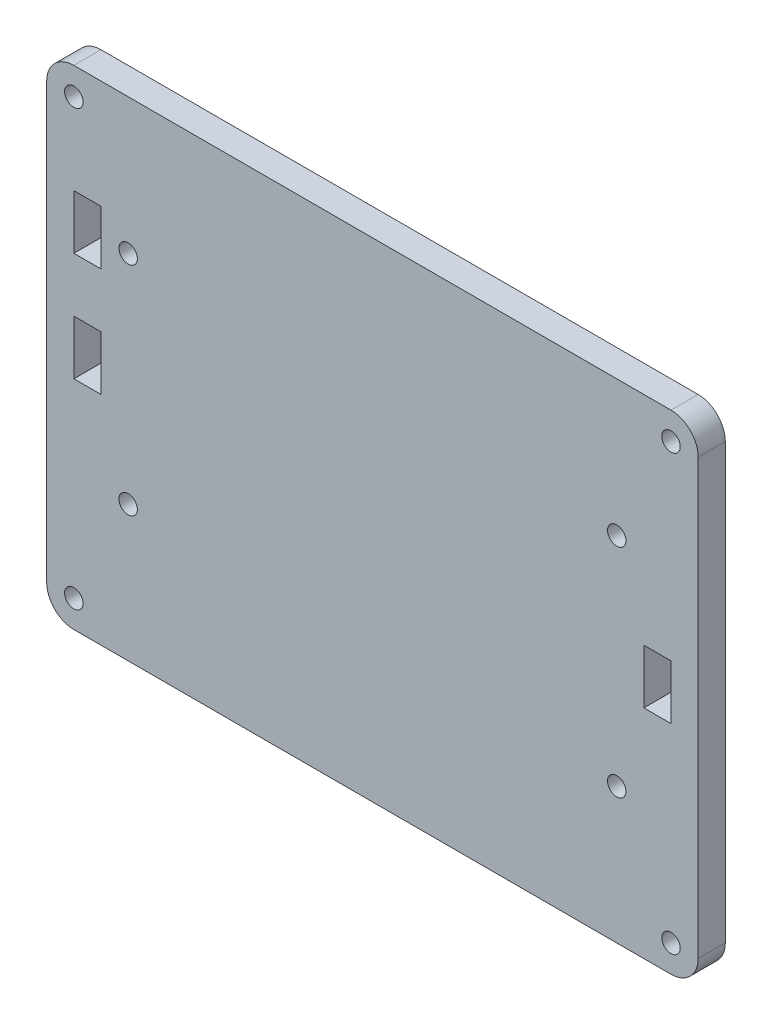
ISO-10303-21;
HEADER;
FILE_DESCRIPTION(('STEP AP214'),'2;1');
FILE_NAME('part.step','',(''),(''),'','','');
FILE_SCHEMA(('AUTOMOTIVE_DESIGN { 1 0 10303 214 1 1 1 1 }'));
ENDSEC;
DATA;
#1=APPLICATION_CONTEXT('core data for automotive mechanical design processes');
#2=APPLICATION_PROTOCOL_DEFINITION('international standard','automotive_design',2000,#1);
#3=PRODUCT_CONTEXT('',#1,'mechanical');
#4=PRODUCT('Part','Part','',(#3));
#5=PRODUCT_RELATED_PRODUCT_CATEGORY('part','',(#4));
#6=PRODUCT_DEFINITION_FORMATION('','',#4);
#7=PRODUCT_DEFINITION_CONTEXT('part definition',#1,'design');
#8=PRODUCT_DEFINITION('design','',#6,#7);
#9=PRODUCT_DEFINITION_SHAPE('','',#8);
#10=(LENGTH_UNIT() NAMED_UNIT(*) SI_UNIT(.MILLI.,.METRE.));
#11=(NAMED_UNIT(*) PLANE_ANGLE_UNIT() SI_UNIT($,.RADIAN.));
#12=(NAMED_UNIT(*) SI_UNIT($,.STERADIAN.) SOLID_ANGLE_UNIT());
#13=UNCERTAINTY_MEASURE_WITH_UNIT(LENGTH_MEASURE(1.E-05),#10,'distance_accuracy_value','');
#14=(GEOMETRIC_REPRESENTATION_CONTEXT(3) GLOBAL_UNCERTAINTY_ASSIGNED_CONTEXT((#13)) GLOBAL_UNIT_ASSIGNED_CONTEXT((#10,
#11,#12)) REPRESENTATION_CONTEXT('',''));
#15=CARTESIAN_POINT('',(0.,0.,0.));
#16=DIRECTION('',(0.,0.,1.));
#17=DIRECTION('',(1.,0.,0.));
#18=AXIS2_PLACEMENT_3D('',#15,#16,#17);
#19=CARTESIAN_POINT('',(-57.7493775578337,29.8597781429745,-5.));
#20=DIRECTION('',(0.,0.,1.));
#21=DIRECTION('',(1.,0.,0.));
#22=AXIS2_PLACEMENT_3D('',#19,#20,#21);
#23=CYLINDRICAL_SURFACE('',#22,5.);
#24=CARTESIAN_POINT('',(-57.7493775578337,29.8597781429745,0.));
#25=DIRECTION('',(0.,0.,1.));
#26=DIRECTION('',(1.,0.,0.));
#27=AXIS2_PLACEMENT_3D('',#24,#25,#26);
#28=CIRCLE('',#27,5.);
#29=CARTESIAN_POINT('',(-57.7493775578337,34.8597781429745,0.));
#30=VERTEX_POINT('',#29);
#31=CARTESIAN_POINT('',(-62.7493775578337,29.8597781429745,0.));
#32=VERTEX_POINT('',#31);
#33=EDGE_CURVE('E325',#30,#32,#28,.T.);
#34=ORIENTED_EDGE('',*,*,#33,.F.);
#35=DIRECTION('',(0.,0.,1.));
#36=VECTOR('',#35,1.);
#37=CARTESIAN_POINT('',(-57.7493775578337,34.8597781429745,-5.));
#38=LINE('',#37,#36);
#39=CARTESIAN_POINT('',(-57.7493775578337,34.8597781429745,-5.));
#40=VERTEX_POINT('',#39);
#41=EDGE_CURVE('E12',#40,#30,#38,.T.);
#42=ORIENTED_EDGE('',*,*,#41,.F.);
#43=CARTESIAN_POINT('',(-57.7493775578337,29.8597781429745,-5.));
#44=DIRECTION('',(0.,0.,1.));
#45=DIRECTION('',(1.,0.,0.));
#46=AXIS2_PLACEMENT_3D('',#43,#44,#45);
#47=CIRCLE('',#46,5.);
#48=CARTESIAN_POINT('',(-62.7493775578337,29.8597781429745,-5.));
#49=VERTEX_POINT('',#48);
#50=EDGE_CURVE('E328',#40,#49,#47,.T.);
#51=ORIENTED_EDGE('',*,*,#50,.T.);
#52=DIRECTION('',(0.,0.,1.));
#53=VECTOR('',#52,1.);
#54=CARTESIAN_POINT('',(-62.7493775578337,29.8597781429745,-5.));
#55=LINE('',#54,#53);
#56=EDGE_CURVE('E44',#49,#32,#55,.T.);
#57=ORIENTED_EDGE('',*,*,#56,.T.);
#58=EDGE_LOOP('',(#34,#42,#51,#57));
#59=FACE_BOUND('',#58,.T.);
#60=ADVANCED_FACE('F41',(#59),#23,.T.);
#61=CARTESIAN_POINT('',(-57.7493775578337,34.8597781429745,-5.));
#62=DIRECTION('',(0.,-1.,0.));
#63=DIRECTION('',(0.,0.,-1.));
#64=AXIS2_PLACEMENT_3D('',#61,#62,#63);
#65=PLANE('',#64);
#66=DIRECTION('',(1.,0.,0.));
#67=VECTOR('',#66,1.);
#68=CARTESIAN_POINT('',(-57.7493775578337,34.8597781429745,0.));
#69=LINE('',#68,#67);
#70=CARTESIAN_POINT('',(52.2506224421662,34.8597781429745,0.));
#71=VERTEX_POINT('',#70);
#72=EDGE_CURVE('E332',#30,#71,#69,.T.);
#73=ORIENTED_EDGE('',*,*,#72,.T.);
#74=DIRECTION('',(0.,0.,1.));
#75=VECTOR('',#74,1.);
#76=CARTESIAN_POINT('',(52.2506224421662,34.8597781429745,-5.));
#77=LINE('',#76,#75);
#78=CARTESIAN_POINT('',(52.2506224421662,34.8597781429745,-5.));
#79=VERTEX_POINT('',#78);
#80=EDGE_CURVE('E49',#79,#71,#77,.T.);
#81=ORIENTED_EDGE('',*,*,#80,.F.);
#82=DIRECTION('',(1.,0.,0.));
#83=VECTOR('',#82,1.);
#84=CARTESIAN_POINT('',(-57.7493775578337,34.8597781429745,-5.));
#85=LINE('',#84,#83);
#86=EDGE_CURVE('E346',#40,#79,#85,.T.);
#87=ORIENTED_EDGE('',*,*,#86,.F.);
#88=ORIENTED_EDGE('',*,*,#41,.T.);
#89=EDGE_LOOP('',(#73,#81,#87,#88));
#90=FACE_BOUND('',#89,.T.);
#91=ADVANCED_FACE('F394',(#90),#65,.F.);
#92=CARTESIAN_POINT('',(52.2506224421663,29.8597781429745,-5.));
#93=DIRECTION('',(0.,0.,1.));
#94=DIRECTION('',(1.,0.,0.));
#95=AXIS2_PLACEMENT_3D('',#92,#93,#94);
#96=CYLINDRICAL_SURFACE('',#95,5.);
#97=CARTESIAN_POINT('',(52.2506224421663,29.8597781429745,0.));
#98=DIRECTION('',(0.,0.,-1.));
#99=DIRECTION('',(-1.,0.,0.));
#100=AXIS2_PLACEMENT_3D('',#97,#98,#99);
#101=CIRCLE('',#100,5.);
#102=CARTESIAN_POINT('',(57.2506224421663,29.8597781429745,0.));
#103=VERTEX_POINT('',#102);
#104=EDGE_CURVE('E364',#71,#103,#101,.T.);
#105=ORIENTED_EDGE('',*,*,#104,.T.);
#106=DIRECTION('',(0.,0.,1.));
#107=VECTOR('',#106,1.);
#108=CARTESIAN_POINT('',(57.2506224421663,29.8597781429745,-5.));
#109=LINE('',#108,#107);
#110=CARTESIAN_POINT('',(57.2506224421663,29.8597781429745,-5.));
#111=VERTEX_POINT('',#110);
#112=EDGE_CURVE('E369',#111,#103,#109,.T.);
#113=ORIENTED_EDGE('',*,*,#112,.F.);
#114=CARTESIAN_POINT('',(52.2506224421663,29.8597781429745,-5.));
#115=DIRECTION('',(0.,0.,-1.));
#116=DIRECTION('',(-1.,0.,0.));
#117=AXIS2_PLACEMENT_3D('',#114,#115,#116);
#118=CIRCLE('',#117,5.);
#119=EDGE_CURVE('E344',#79,#111,#118,.T.);
#120=ORIENTED_EDGE('',*,*,#119,.F.);
#121=ORIENTED_EDGE('',*,*,#80,.T.);
#122=EDGE_LOOP('',(#105,#113,#120,#121));
#123=FACE_BOUND('',#122,.T.);
#124=ADVANCED_FACE('F398',(#123),#96,.T.);
#125=CARTESIAN_POINT('',(57.2506224421663,29.8597781429745,-5.));
#126=DIRECTION('',(-1.,0.,0.));
#127=DIRECTION('',(0.,-1.,0.));
#128=AXIS2_PLACEMENT_3D('',#125,#126,#127);
#129=PLANE('',#128);
#130=DIRECTION('',(0.,-1.,0.));
#131=VECTOR('',#130,1.);
#132=CARTESIAN_POINT('',(57.2506224421663,29.8597781429745,0.));
#133=LINE('',#132,#131);
#134=CARTESIAN_POINT('',(57.2506224421663,-50.1402218570254,0.));
#135=VERTEX_POINT('',#134);
#136=EDGE_CURVE('E362',#103,#135,#133,.T.);
#137=ORIENTED_EDGE('',*,*,#136,.T.);
#138=DIRECTION('',(0.,0.,1.));
#139=VECTOR('',#138,1.);
#140=CARTESIAN_POINT('',(57.2506224421663,-50.1402218570254,-5.));
#141=LINE('',#140,#139);
#142=CARTESIAN_POINT('',(57.2506224421663,-50.1402218570254,-5.));
#143=VERTEX_POINT('',#142);
#144=EDGE_CURVE('E372',#143,#135,#141,.T.);
#145=ORIENTED_EDGE('',*,*,#144,.F.);
#146=DIRECTION('',(0.,-1.,0.));
#147=VECTOR('',#146,1.);
#148=CARTESIAN_POINT('',(57.2506224421663,29.8597781429745,-5.));
#149=LINE('',#148,#147);
#150=EDGE_CURVE('E342',#111,#143,#149,.T.);
#151=ORIENTED_EDGE('',*,*,#150,.F.);
#152=ORIENTED_EDGE('',*,*,#112,.T.);
#153=EDGE_LOOP('',(#137,#145,#151,#152));
#154=FACE_BOUND('',#153,.T.);
#155=ADVANCED_FACE('F417',(#154),#129,.F.);
#156=CARTESIAN_POINT('',(52.2506224421663,-50.1402218570255,-5.));
#157=DIRECTION('',(0.,0.,1.));
#158=DIRECTION('',(1.,0.,0.));
#159=AXIS2_PLACEMENT_3D('',#156,#157,#158);
#160=CYLINDRICAL_SURFACE('',#159,5.);
#161=CARTESIAN_POINT('',(52.2506224421663,-50.1402218570255,0.));
#162=DIRECTION('',(0.,0.,-1.));
#163=DIRECTION('',(-1.,0.,0.));
#164=AXIS2_PLACEMENT_3D('',#161,#162,#163);
#165=CIRCLE('',#164,5.);
#166=CARTESIAN_POINT('',(52.2506224421663,-55.1402218570255,0.));
#167=VERTEX_POINT('',#166);
#168=EDGE_CURVE('E359',#135,#167,#165,.T.);
#169=ORIENTED_EDGE('',*,*,#168,.T.);
#170=DIRECTION('',(0.,0.,1.));
#171=VECTOR('',#170,1.);
#172=CARTESIAN_POINT('',(52.2506224421663,-55.1402218570255,-5.));
#173=LINE('',#172,#171);
#174=CARTESIAN_POINT('',(52.2506224421663,-55.1402218570255,-5.));
#175=VERTEX_POINT('',#174);
#176=EDGE_CURVE('E375',#175,#167,#173,.T.);
#177=ORIENTED_EDGE('',*,*,#176,.F.);
#178=CARTESIAN_POINT('',(52.2506224421663,-50.1402218570255,-5.));
#179=DIRECTION('',(0.,0.,-1.));
#180=DIRECTION('',(-1.,0.,0.));
#181=AXIS2_PLACEMENT_3D('',#178,#179,#180);
#182=CIRCLE('',#181,5.);
#183=EDGE_CURVE('E340',#143,#175,#182,.T.);
#184=ORIENTED_EDGE('',*,*,#183,.F.);
#185=ORIENTED_EDGE('',*,*,#144,.T.);
#186=EDGE_LOOP('',(#169,#177,#184,#185));
#187=FACE_BOUND('',#186,.T.);
#188=ADVANCED_FACE('F415',(#187),#160,.T.);
#189=CARTESIAN_POINT('',(-57.7493775578337,-55.1402218570255,-5.));
#190=DIRECTION('',(0.,-1.,0.));
#191=DIRECTION('',(0.,0.,-1.));
#192=AXIS2_PLACEMENT_3D('',#189,#190,#191);
#193=PLANE('',#192);
#194=DIRECTION('',(1.,0.,0.));
#195=VECTOR('',#194,1.);
#196=CARTESIAN_POINT('',(-57.7493775578337,-55.1402218570255,0.));
#197=LINE('',#196,#195);
#198=CARTESIAN_POINT('',(-57.7493775578337,-55.1402218570255,0.));
#199=VERTEX_POINT('',#198);
#200=EDGE_CURVE('E356',#199,#167,#197,.T.);
#201=ORIENTED_EDGE('',*,*,#200,.F.);
#202=DIRECTION('',(0.,0.,1.));
#203=VECTOR('',#202,1.);
#204=CARTESIAN_POINT('',(-57.7493775578337,-55.1402218570255,-5.));
#205=LINE('',#204,#203);
#206=CARTESIAN_POINT('',(-57.7493775578337,-55.1402218570255,-5.));
#207=VERTEX_POINT('',#206);
#208=EDGE_CURVE('E377',#207,#199,#205,.T.);
#209=ORIENTED_EDGE('',*,*,#208,.F.);
#210=DIRECTION('',(1.,0.,0.));
#211=VECTOR('',#210,1.);
#212=CARTESIAN_POINT('',(-57.7493775578337,-55.1402218570255,-5.));
#213=LINE('',#212,#211);
#214=EDGE_CURVE('E337',#207,#175,#213,.T.);
#215=ORIENTED_EDGE('',*,*,#214,.T.);
#216=ORIENTED_EDGE('',*,*,#176,.T.);
#217=EDGE_LOOP('',(#201,#209,#215,#216));
#218=FACE_BOUND('',#217,.T.);
#219=ADVANCED_FACE('F411',(#218),#193,.T.);
#220=CARTESIAN_POINT('',(-57.7493775578337,-50.1402218570255,-5.));
#221=DIRECTION('',(0.,0.,1.));
#222=DIRECTION('',(1.,0.,0.));
#223=AXIS2_PLACEMENT_3D('',#220,#221,#222);
#224=CYLINDRICAL_SURFACE('',#223,5.);
#225=CARTESIAN_POINT('',(-57.7493775578337,-50.1402218570255,0.));
#226=DIRECTION('',(0.,0.,-1.));
#227=DIRECTION('',(-1.,0.,0.));
#228=AXIS2_PLACEMENT_3D('',#225,#226,#227);
#229=CIRCLE('',#228,5.);
#230=CARTESIAN_POINT('',(-62.7493775578337,-50.1402218570254,0.));
#231=VERTEX_POINT('',#230);
#232=EDGE_CURVE('E353',#199,#231,#229,.T.);
#233=ORIENTED_EDGE('',*,*,#232,.T.);
#234=DIRECTION('',(0.,0.,1.));
#235=VECTOR('',#234,1.);
#236=CARTESIAN_POINT('',(-62.7493775578337,-50.1402218570254,-5.));
#237=LINE('',#236,#235);
#238=CARTESIAN_POINT('',(-62.7493775578337,-50.1402218570254,-5.));
#239=VERTEX_POINT('',#238);
#240=EDGE_CURVE('E378',#239,#231,#237,.T.);
#241=ORIENTED_EDGE('',*,*,#240,.F.);
#242=CARTESIAN_POINT('',(-57.7493775578337,-50.1402218570255,-5.));
#243=DIRECTION('',(0.,0.,-1.));
#244=DIRECTION('',(-1.,0.,0.));
#245=AXIS2_PLACEMENT_3D('',#242,#243,#244);
#246=CIRCLE('',#245,5.);
#247=EDGE_CURVE('E335',#207,#239,#246,.T.);
#248=ORIENTED_EDGE('',*,*,#247,.F.);
#249=ORIENTED_EDGE('',*,*,#208,.T.);
#250=EDGE_LOOP('',(#233,#241,#248,#249));
#251=FACE_BOUND('',#250,.T.);
#252=ADVANCED_FACE('F407',(#251),#224,.T.);
#253=CARTESIAN_POINT('',(-62.7493775578337,29.8597781429745,-5.));
#254=DIRECTION('',(-1.,0.,0.));
#255=DIRECTION('',(0.,-1.,0.));
#256=AXIS2_PLACEMENT_3D('',#253,#254,#255);
#257=PLANE('',#256);
#258=DIRECTION('',(0.,-1.,0.));
#259=VECTOR('',#258,1.);
#260=CARTESIAN_POINT('',(-62.7493775578337,29.8597781429745,0.));
#261=LINE('',#260,#259);
#262=EDGE_CURVE('E350',#32,#231,#261,.T.);
#263=ORIENTED_EDGE('',*,*,#262,.F.);
#264=ORIENTED_EDGE('',*,*,#56,.F.);
#265=DIRECTION('',(0.,-1.,0.));
#266=VECTOR('',#265,1.);
#267=CARTESIAN_POINT('',(-62.7493775578337,29.8597781429745,-5.));
#268=LINE('',#267,#266);
#269=EDGE_CURVE('E331',#49,#239,#268,.T.);
#270=ORIENTED_EDGE('',*,*,#269,.T.);
#271=ORIENTED_EDGE('',*,*,#240,.T.);
#272=EDGE_LOOP('',(#263,#264,#270,#271));
#273=FACE_BOUND('',#272,.T.);
#274=ADVANCED_FACE('F386',(#273),#257,.T.);
#275=CARTESIAN_POINT('',(-57.7493775578337,29.8597781429745,-5.));
#276=DIRECTION('',(0.,0.,1.));
#277=DIRECTION('',(1.,0.,0.));
#278=AXIS2_PLACEMENT_3D('',#275,#276,#277);
#279=PLANE('',#278);
#280=DIRECTION('',(-1.,0.,0.));
#281=VECTOR('',#280,1.);
#282=CARTESIAN_POINT('',(-57.7493775578337,14.8816046276279,-5.));
#283=LINE('',#282,#281);
#284=CARTESIAN_POINT('',(-52.7493775578337,14.8816046276279,-5.));
#285=VERTEX_POINT('',#284);
#286=CARTESIAN_POINT('',(-57.7493775578337,14.8816046276279,-5.));
#287=VERTEX_POINT('',#286);
#288=EDGE_CURVE('E273',#285,#287,#283,.T.);
#289=ORIENTED_EDGE('',*,*,#288,.T.);
#290=DIRECTION('',(0.,-1.,0.));
#291=VECTOR('',#290,1.);
#292=CARTESIAN_POINT('',(-57.7493775578337,29.8597781429745,-5.));
#293=LINE('',#292,#291);
#294=CARTESIAN_POINT('',(-57.7493775578337,4.88160462762794,-5.));
#295=VERTEX_POINT('',#294);
#296=EDGE_CURVE('E276',#287,#295,#293,.T.);
#297=ORIENTED_EDGE('',*,*,#296,.T.);
#298=DIRECTION('',(1.,0.,0.));
#299=VECTOR('',#298,1.);
#300=CARTESIAN_POINT('',(-57.7493775578337,4.88160462762794,-5.));
#301=LINE('',#300,#299);
#302=CARTESIAN_POINT('',(-52.7493775578337,4.88160462762794,-5.));
#303=VERTEX_POINT('',#302);
#304=EDGE_CURVE('E267',#295,#303,#301,.T.);
#305=ORIENTED_EDGE('',*,*,#304,.T.);
#306=DIRECTION('',(0.,1.,0.));
#307=VECTOR('',#306,1.);
#308=CARTESIAN_POINT('',(-52.7493775578337,29.8597781429745,-5.));
#309=LINE('',#308,#307);
#310=EDGE_CURVE('E270',#303,#285,#309,.T.);
#311=ORIENTED_EDGE('',*,*,#310,.T.);
#312=EDGE_LOOP('',(#289,#297,#305,#311));
#313=FACE_BOUND('',#312,.T.);
#314=DIRECTION('',(1.,0.,0.));
#315=VECTOR('',#314,1.);
#316=CARTESIAN_POINT('',(-57.7493775578335,-15.1402218570257,-5.));
#317=LINE('',#316,#315);
#318=CARTESIAN_POINT('',(47.2506224421666,-15.1402218570251,-5.));
#319=VERTEX_POINT('',#318);
#320=CARTESIAN_POINT('',(52.2506224421666,-15.1402218570251,-5.));
#321=VERTEX_POINT('',#320);
#322=EDGE_CURVE('E264',#319,#321,#317,.T.);
#323=ORIENTED_EDGE('',*,*,#322,.T.);
#324=DIRECTION('',(0.,1.,0.));
#325=VECTOR('',#324,1.);
#326=CARTESIAN_POINT('',(52.2506224421663,29.8597781429752,-5.));
#327=LINE('',#326,#325);
#328=CARTESIAN_POINT('',(52.2506224421666,-5.1402218570251,-5.));
#329=VERTEX_POINT('',#328);
#330=EDGE_CURVE('E185',#321,#329,#327,.T.);
#331=ORIENTED_EDGE('',*,*,#330,.T.);
#332=DIRECTION('',(-1.,0.,0.));
#333=VECTOR('',#332,1.);
#334=CARTESIAN_POINT('',(-57.7493775578335,-5.14022185702571,-5.));
#335=LINE('',#334,#333);
#336=CARTESIAN_POINT('',(47.2506224421666,-5.14022185702513,-5.));
#337=VERTEX_POINT('',#336);
#338=EDGE_CURVE('E258',#329,#337,#335,.T.);
#339=ORIENTED_EDGE('',*,*,#338,.T.);
#340=DIRECTION('',(0.,-1.,0.));
#341=VECTOR('',#340,1.);
#342=CARTESIAN_POINT('',(47.2506224421663,29.8597781429753,-5.));
#343=LINE('',#342,#341);
#344=EDGE_CURVE('E261',#337,#319,#343,.T.);
#345=ORIENTED_EDGE('',*,*,#344,.T.);
#346=EDGE_LOOP('',(#323,#331,#339,#345));
#347=FACE_BOUND('',#346,.T.);
#348=DIRECTION('',(-1.,0.,0.));
#349=VECTOR('',#348,1.);
#350=CARTESIAN_POINT('',(-57.7493775578337,-5.14022185702547,-5.));
#351=LINE('',#350,#349);
#352=CARTESIAN_POINT('',(-52.7493775578337,-5.14022185702547,-5.));
#353=VERTEX_POINT('',#352);
#354=CARTESIAN_POINT('',(-57.7493775578337,-5.14022185702547,-5.));
#355=VERTEX_POINT('',#354);
#356=EDGE_CURVE('E252',#353,#355,#351,.T.);
#357=ORIENTED_EDGE('',*,*,#356,.T.);
#358=DIRECTION('',(0.,-1.,0.));
#359=VECTOR('',#358,1.);
#360=CARTESIAN_POINT('',(-57.7493775578337,29.8597781429745,-5.));
#361=LINE('',#360,#359);
#362=CARTESIAN_POINT('',(-57.7493775578337,-15.1402218570255,-5.));
#363=VERTEX_POINT('',#362);
#364=EDGE_CURVE('E255',#355,#363,#361,.T.);
#365=ORIENTED_EDGE('',*,*,#364,.T.);
#366=DIRECTION('',(1.,0.,0.));
#367=VECTOR('',#366,1.);
#368=CARTESIAN_POINT('',(-57.7493775578337,-15.1402218570255,-5.));
#369=LINE('',#368,#367);
#370=CARTESIAN_POINT('',(-52.7493775578337,-15.1402218570255,-5.));
#371=VERTEX_POINT('',#370);
#372=EDGE_CURVE('E240',#363,#371,#369,.T.);
#373=ORIENTED_EDGE('',*,*,#372,.T.);
#374=DIRECTION('',(0.,1.,0.));
#375=VECTOR('',#374,1.);
#376=CARTESIAN_POINT('',(-52.7493775578337,29.8597781429745,-5.));
#377=LINE('',#376,#375);
#378=EDGE_CURVE('E249',#371,#353,#377,.T.);
#379=ORIENTED_EDGE('',*,*,#378,.T.);
#380=EDGE_LOOP('',(#357,#365,#373,#379));
#381=FACE_BOUND('',#380,.T.);
#382=CARTESIAN_POINT('',(52.2506224421663,29.8597781429745,-5.));
#383=DIRECTION('',(0.,0.,1.));
#384=DIRECTION('',(1.,0.,0.));
#385=AXIS2_PLACEMENT_3D('',#382,#383,#384);
#386=CIRCLE('',#385,1.7);
#387=CARTESIAN_POINT('',(53.9506224421663,29.8597781429745,-5.));
#388=VERTEX_POINT('',#387);
#389=EDGE_CURVE('E298',#388,#388,#386,.T.);
#390=ORIENTED_EDGE('',*,*,#389,.T.);
#391=EDGE_LOOP('',(#390));
#392=FACE_BOUND('',#391,.T.);
#393=CARTESIAN_POINT('',(-47.7493775578337,9.85977814297453,-5.));
#394=DIRECTION('',(0.,0.,1.));
#395=DIRECTION('',(1.,0.,0.));
#396=AXIS2_PLACEMENT_3D('',#393,#394,#395);
#397=CIRCLE('',#396,1.7);
#398=CARTESIAN_POINT('',(-46.0493775578337,9.85977814297453,-5.));
#399=VERTEX_POINT('',#398);
#400=EDGE_CURVE('E305',#399,#399,#397,.T.);
#401=ORIENTED_EDGE('',*,*,#400,.T.);
#402=EDGE_LOOP('',(#401));
#403=FACE_BOUND('',#402,.T.);
#404=CARTESIAN_POINT('',(-57.7493775578337,-50.1402218570255,-5.));
#405=DIRECTION('',(0.,0.,1.));
#406=DIRECTION('',(1.,0.,0.));
#407=AXIS2_PLACEMENT_3D('',#404,#405,#406);
#408=CIRCLE('',#407,1.7);
#409=CARTESIAN_POINT('',(-56.0493775578337,-50.1402218570255,-5.));
#410=VERTEX_POINT('',#409);
#411=EDGE_CURVE('E311',#410,#410,#408,.T.);
#412=ORIENTED_EDGE('',*,*,#411,.T.);
#413=EDGE_LOOP('',(#412));
#414=FACE_BOUND('',#413,.T.);
#415=CARTESIAN_POINT('',(52.2506224421663,-50.1402218570255,-5.));
#416=DIRECTION('',(0.,0.,1.));
#417=DIRECTION('',(1.,0.,0.));
#418=AXIS2_PLACEMENT_3D('',#415,#416,#417);
#419=CIRCLE('',#418,1.7);
#420=CARTESIAN_POINT('',(53.9506224421663,-50.1402218570255,-5.));
#421=VERTEX_POINT('',#420);
#422=EDGE_CURVE('E317',#421,#421,#419,.T.);
#423=ORIENTED_EDGE('',*,*,#422,.T.);
#424=EDGE_LOOP('',(#423));
#425=FACE_BOUND('',#424,.T.);
#426=CARTESIAN_POINT('',(42.2506224421663,-30.1402218570255,-5.));
#427=DIRECTION('',(0.,0.,1.));
#428=DIRECTION('',(1.,0.,0.));
#429=AXIS2_PLACEMENT_3D('',#426,#427,#428);
#430=CIRCLE('',#429,1.7);
#431=CARTESIAN_POINT('',(43.9506224421663,-30.1402218570255,-5.));
#432=VERTEX_POINT('',#431);
#433=EDGE_CURVE('E280',#432,#432,#430,.T.);
#434=ORIENTED_EDGE('',*,*,#433,.T.);
#435=EDGE_LOOP('',(#434));
#436=FACE_BOUND('',#435,.T.);
#437=CARTESIAN_POINT('',(42.2506224421663,9.85977814297453,-5.));
#438=DIRECTION('',(0.,0.,1.));
#439=DIRECTION('',(1.,0.,0.));
#440=AXIS2_PLACEMENT_3D('',#437,#438,#439);
#441=CIRCLE('',#440,1.7);
#442=CARTESIAN_POINT('',(43.9506224421663,9.85977814297453,-5.));
#443=VERTEX_POINT('',#442);
#444=EDGE_CURVE('E293',#443,#443,#441,.T.);
#445=ORIENTED_EDGE('',*,*,#444,.T.);
#446=EDGE_LOOP('',(#445));
#447=FACE_BOUND('',#446,.T.);
#448=CARTESIAN_POINT('',(-47.7493775578337,-30.1402218570255,-5.));
#449=DIRECTION('',(0.,0.,1.));
#450=DIRECTION('',(1.,0.,0.));
#451=AXIS2_PLACEMENT_3D('',#448,#449,#450);
#452=CIRCLE('',#451,1.7);
#453=CARTESIAN_POINT('',(-46.0493775578337,-30.1402218570255,-5.));
#454=VERTEX_POINT('',#453);
#455=EDGE_CURVE('E286',#454,#454,#452,.T.);
#456=ORIENTED_EDGE('',*,*,#455,.T.);
#457=EDGE_LOOP('',(#456));
#458=FACE_BOUND('',#457,.T.);
#459=CARTESIAN_POINT('',(-57.7493775578337,29.8597781429745,-5.));
#460=DIRECTION('',(0.,0.,1.));
#461=DIRECTION('',(1.,0.,0.));
#462=AXIS2_PLACEMENT_3D('',#459,#460,#461);
#463=CIRCLE('',#462,1.7);
#464=CARTESIAN_POINT('',(-56.0493775578337,29.8597781429745,-5.));
#465=VERTEX_POINT('',#464);
#466=EDGE_CURVE('E322',#465,#465,#463,.T.);
#467=ORIENTED_EDGE('',*,*,#466,.T.);
#468=EDGE_LOOP('',(#467));
#469=FACE_BOUND('',#468,.T.);
#470=ORIENTED_EDGE('',*,*,#50,.F.);
#471=ORIENTED_EDGE('',*,*,#86,.T.);
#472=ORIENTED_EDGE('',*,*,#119,.T.);
#473=ORIENTED_EDGE('',*,*,#150,.T.);
#474=ORIENTED_EDGE('',*,*,#183,.T.);
#475=ORIENTED_EDGE('',*,*,#214,.F.);
#476=ORIENTED_EDGE('',*,*,#247,.T.);
#477=ORIENTED_EDGE('',*,*,#269,.F.);
#478=EDGE_LOOP('',(#470,#471,#472,#473,#474,#475,#476,#477));
#479=FACE_BOUND('',#478,.T.);
#480=ADVANCED_FACE('F402',(#313,#347,#381,#392,#403,#414,#425,#436,#447,#458,#469,#479),#279,.F.);
#481=CARTESIAN_POINT('',(-57.7493775578337,29.8597781429745,0.));
#482=DIRECTION('',(0.,0.,1.));
#483=DIRECTION('',(1.,0.,0.));
#484=AXIS2_PLACEMENT_3D('',#481,#482,#483);
#485=PLANE('',#484);
#486=DIRECTION('',(0.,-1.,0.));
#487=VECTOR('',#486,1.);
#488=CARTESIAN_POINT('',(-57.7493775578337,14.8816046276279,0.));
#489=LINE('',#488,#487);
#490=CARTESIAN_POINT('',(-57.7493775578337,14.8816046276279,0.));
#491=VERTEX_POINT('',#490);
#492=CARTESIAN_POINT('',(-57.7493775578337,4.88160462762794,0.));
#493=VERTEX_POINT('',#492);
#494=EDGE_CURVE('E189',#491,#493,#489,.T.);
#495=ORIENTED_EDGE('',*,*,#494,.F.);
#496=DIRECTION('',(-1.,0.,0.));
#497=VECTOR('',#496,1.);
#498=CARTESIAN_POINT('',(-57.7493775578337,14.8816046276279,0.));
#499=LINE('',#498,#497);
#500=CARTESIAN_POINT('',(-52.7493775578337,14.8816046276279,0.));
#501=VERTEX_POINT('',#500);
#502=EDGE_CURVE('E215',#501,#491,#499,.T.);
#503=ORIENTED_EDGE('',*,*,#502,.F.);
#504=DIRECTION('',(0.,1.,0.));
#505=VECTOR('',#504,1.);
#506=CARTESIAN_POINT('',(-52.7493775578337,14.8816046276279,0.));
#507=LINE('',#506,#505);
#508=CARTESIAN_POINT('',(-52.7493775578337,4.88160462762794,0.));
#509=VERTEX_POINT('',#508);
#510=EDGE_CURVE('E223',#509,#501,#507,.T.);
#511=ORIENTED_EDGE('',*,*,#510,.F.);
#512=DIRECTION('',(1.,0.,0.));
#513=VECTOR('',#512,1.);
#514=CARTESIAN_POINT('',(-57.7493775578337,4.88160462762794,0.));
#515=LINE('',#514,#513);
#516=EDGE_CURVE('E226',#493,#509,#515,.T.);
#517=ORIENTED_EDGE('',*,*,#516,.F.);
#518=EDGE_LOOP('',(#495,#503,#511,#517));
#519=FACE_BOUND('',#518,.T.);
#520=DIRECTION('',(0.,1.,0.));
#521=VECTOR('',#520,1.);
#522=CARTESIAN_POINT('',(52.2506224421666,-5.1402218570251,0.));
#523=LINE('',#522,#521);
#524=CARTESIAN_POINT('',(52.2506224421666,-15.1402218570251,0.));
#525=VERTEX_POINT('',#524);
#526=CARTESIAN_POINT('',(52.2506224421666,-5.1402218570251,0.));
#527=VERTEX_POINT('',#526);
#528=EDGE_CURVE('E182',#525,#527,#523,.T.);
#529=ORIENTED_EDGE('',*,*,#528,.F.);
#530=DIRECTION('',(1.,0.,0.));
#531=VECTOR('',#530,1.);
#532=CARTESIAN_POINT('',(52.2506224421666,-15.1402218570251,0.));
#533=LINE('',#532,#531);
#534=CARTESIAN_POINT('',(47.2506224421666,-15.1402218570251,0.));
#535=VERTEX_POINT('',#534);
#536=EDGE_CURVE('E192',#535,#525,#533,.T.);
#537=ORIENTED_EDGE('',*,*,#536,.F.);
#538=DIRECTION('',(0.,-1.,0.));
#539=VECTOR('',#538,1.);
#540=CARTESIAN_POINT('',(47.2506224421666,-5.14022185702513,0.));
#541=LINE('',#540,#539);
#542=CARTESIAN_POINT('',(47.2506224421666,-5.14022185702513,0.));
#543=VERTEX_POINT('',#542);
#544=EDGE_CURVE('E198',#543,#535,#541,.T.);
#545=ORIENTED_EDGE('',*,*,#544,.F.);
#546=DIRECTION('',(-1.,0.,0.));
#547=VECTOR('',#546,1.);
#548=CARTESIAN_POINT('',(52.2506224421666,-5.1402218570251,0.));
#549=LINE('',#548,#547);
#550=EDGE_CURVE('E204',#527,#543,#549,.T.);
#551=ORIENTED_EDGE('',*,*,#550,.F.);
#552=EDGE_LOOP('',(#529,#537,#545,#551));
#553=FACE_BOUND('',#552,.T.);
#554=DIRECTION('',(0.,-1.,0.));
#555=VECTOR('',#554,1.);
#556=CARTESIAN_POINT('',(-57.7493775578337,-5.14022185702547,0.));
#557=LINE('',#556,#555);
#558=CARTESIAN_POINT('',(-57.7493775578337,-5.14022185702547,0.));
#559=VERTEX_POINT('',#558);
#560=CARTESIAN_POINT('',(-57.7493775578337,-15.1402218570255,0.));
#561=VERTEX_POINT('',#560);
#562=EDGE_CURVE('E205',#559,#561,#557,.T.);
#563=ORIENTED_EDGE('',*,*,#562,.F.);
#564=DIRECTION('',(-1.,0.,0.));
#565=VECTOR('',#564,1.);
#566=CARTESIAN_POINT('',(-57.7493775578337,-5.14022185702547,0.));
#567=LINE('',#566,#565);
#568=CARTESIAN_POINT('',(-52.7493775578337,-5.14022185702547,0.));
#569=VERTEX_POINT('',#568);
#570=EDGE_CURVE('E234',#569,#559,#567,.T.);
#571=ORIENTED_EDGE('',*,*,#570,.F.);
#572=DIRECTION('',(0.,1.,0.));
#573=VECTOR('',#572,1.);
#574=CARTESIAN_POINT('',(-52.7493775578337,-5.14022185702547,0.));
#575=LINE('',#574,#573);
#576=CARTESIAN_POINT('',(-52.7493775578337,-15.1402218570255,0.));
#577=VERTEX_POINT('',#576);
#578=EDGE_CURVE('E231',#577,#569,#575,.T.);
#579=ORIENTED_EDGE('',*,*,#578,.F.);
#580=DIRECTION('',(1.,0.,0.));
#581=VECTOR('',#580,1.);
#582=CARTESIAN_POINT('',(-57.7493775578337,-15.1402218570255,0.));
#583=LINE('',#582,#581);
#584=EDGE_CURVE('E207',#561,#577,#583,.T.);
#585=ORIENTED_EDGE('',*,*,#584,.F.);
#586=EDGE_LOOP('',(#563,#571,#579,#585));
#587=FACE_BOUND('',#586,.T.);
#588=CARTESIAN_POINT('',(52.2506224421663,29.8597781429745,0.));
#589=DIRECTION('',(0.,0.,1.));
#590=DIRECTION('',(1.,0.,0.));
#591=AXIS2_PLACEMENT_3D('',#588,#589,#590);
#592=CIRCLE('',#591,1.7);
#593=CARTESIAN_POINT('',(53.9506224421663,29.8597781429745,0.));
#594=VERTEX_POINT('',#593);
#595=EDGE_CURVE('E302',#594,#594,#592,.T.);
#596=ORIENTED_EDGE('',*,*,#595,.F.);
#597=EDGE_LOOP('',(#596));
#598=FACE_BOUND('',#597,.T.);
#599=CARTESIAN_POINT('',(-47.7493775578337,9.85977814297453,0.));
#600=DIRECTION('',(0.,0.,1.));
#601=DIRECTION('',(1.,0.,0.));
#602=AXIS2_PLACEMENT_3D('',#599,#600,#601);
#603=CIRCLE('',#602,1.7);
#604=CARTESIAN_POINT('',(-46.0493775578337,9.85977814297453,0.));
#605=VERTEX_POINT('',#604);
#606=EDGE_CURVE('E308',#605,#605,#603,.T.);
#607=ORIENTED_EDGE('',*,*,#606,.F.);
#608=EDGE_LOOP('',(#607));
#609=FACE_BOUND('',#608,.T.);
#610=CARTESIAN_POINT('',(-57.7493775578337,-50.1402218570255,0.));
#611=DIRECTION('',(0.,0.,1.));
#612=DIRECTION('',(1.,0.,0.));
#613=AXIS2_PLACEMENT_3D('',#610,#611,#612);
#614=CIRCLE('',#613,1.7);
#615=CARTESIAN_POINT('',(-56.0493775578337,-50.1402218570255,0.));
#616=VERTEX_POINT('',#615);
#617=EDGE_CURVE('E314',#616,#616,#614,.T.);
#618=ORIENTED_EDGE('',*,*,#617,.F.);
#619=EDGE_LOOP('',(#618));
#620=FACE_BOUND('',#619,.T.);
#621=CARTESIAN_POINT('',(52.2506224421663,-50.1402218570255,0.));
#622=DIRECTION('',(0.,0.,1.));
#623=DIRECTION('',(1.,0.,0.));
#624=AXIS2_PLACEMENT_3D('',#621,#622,#623);
#625=CIRCLE('',#624,1.7);
#626=CARTESIAN_POINT('',(53.9506224421663,-50.1402218570255,0.));
#627=VERTEX_POINT('',#626);
#628=EDGE_CURVE('E289',#627,#627,#625,.T.);
#629=ORIENTED_EDGE('',*,*,#628,.F.);
#630=EDGE_LOOP('',(#629));
#631=FACE_BOUND('',#630,.T.);
#632=CARTESIAN_POINT('',(42.2506224421663,-30.1402218570255,0.));
#633=DIRECTION('',(0.,0.,1.));
#634=DIRECTION('',(1.,0.,0.));
#635=AXIS2_PLACEMENT_3D('',#632,#633,#634);
#636=CIRCLE('',#635,1.7);
#637=CARTESIAN_POINT('',(43.9506224421663,-30.1402218570255,0.));
#638=VERTEX_POINT('',#637);
#639=EDGE_CURVE('E279',#638,#638,#636,.T.);
#640=ORIENTED_EDGE('',*,*,#639,.F.);
#641=EDGE_LOOP('',(#640));
#642=FACE_BOUND('',#641,.T.);
#643=CARTESIAN_POINT('',(42.2506224421663,9.85977814297453,0.));
#644=DIRECTION('',(0.,0.,1.));
#645=DIRECTION('',(1.,0.,0.));
#646=AXIS2_PLACEMENT_3D('',#643,#644,#645);
#647=CIRCLE('',#646,1.7);
#648=CARTESIAN_POINT('',(43.9506224421663,9.85977814297453,0.));
#649=VERTEX_POINT('',#648);
#650=EDGE_CURVE('E283',#649,#649,#647,.T.);
#651=ORIENTED_EDGE('',*,*,#650,.F.);
#652=EDGE_LOOP('',(#651));
#653=FACE_BOUND('',#652,.T.);
#654=CARTESIAN_POINT('',(-47.7493775578337,-30.1402218570255,0.));
#655=DIRECTION('',(0.,0.,1.));
#656=DIRECTION('',(1.,0.,0.));
#657=AXIS2_PLACEMENT_3D('',#654,#655,#656);
#658=CIRCLE('',#657,1.7);
#659=CARTESIAN_POINT('',(-46.0493775578337,-30.1402218570255,0.));
#660=VERTEX_POINT('',#659);
#661=EDGE_CURVE('E290',#660,#660,#658,.T.);
#662=ORIENTED_EDGE('',*,*,#661,.F.);
#663=EDGE_LOOP('',(#662));
#664=FACE_BOUND('',#663,.T.);
#665=CARTESIAN_POINT('',(-57.7493775578337,29.8597781429745,0.));
#666=DIRECTION('',(0.,0.,1.));
#667=DIRECTION('',(1.,0.,0.));
#668=AXIS2_PLACEMENT_3D('',#665,#666,#667);
#669=CIRCLE('',#668,1.7);
#670=CARTESIAN_POINT('',(-56.0493775578337,29.8597781429745,0.));
#671=VERTEX_POINT('',#670);
#672=EDGE_CURVE('E301',#671,#671,#669,.T.);
#673=ORIENTED_EDGE('',*,*,#672,.F.);
#674=EDGE_LOOP('',(#673));
#675=FACE_BOUND('',#674,.T.);
#676=ORIENTED_EDGE('',*,*,#33,.T.);
#677=ORIENTED_EDGE('',*,*,#262,.T.);
#678=ORIENTED_EDGE('',*,*,#232,.F.);
#679=ORIENTED_EDGE('',*,*,#200,.T.);
#680=ORIENTED_EDGE('',*,*,#168,.F.);
#681=ORIENTED_EDGE('',*,*,#136,.F.);
#682=ORIENTED_EDGE('',*,*,#104,.F.);
#683=ORIENTED_EDGE('',*,*,#72,.F.);
#684=EDGE_LOOP('',(#676,#677,#678,#679,#680,#681,#682,#683));
#685=FACE_BOUND('',#684,.T.);
#686=ADVANCED_FACE('F202',(#519,#553,#587,#598,#609,#620,#631,#642,#653,#664,#675,#685),#485,.T.);
#687=CARTESIAN_POINT('',(-57.7493775578337,29.8597781429745,-5.));
#688=DIRECTION('',(0.,0.,1.));
#689=DIRECTION('',(1.,0.,0.));
#690=AXIS2_PLACEMENT_3D('',#687,#688,#689);
#691=CYLINDRICAL_SURFACE('',#690,1.7);
#692=ORIENTED_EDGE('',*,*,#466,.F.);
#693=EDGE_LOOP('',(#692));
#694=FACE_BOUND('',#693,.T.);
#695=ORIENTED_EDGE('',*,*,#672,.T.);
#696=EDGE_LOOP('',(#695));
#697=FACE_BOUND('',#696,.T.);
#698=ADVANCED_FACE('F436',(#694,#697),#691,.F.);
#699=CARTESIAN_POINT('',(-47.7493775578337,-30.1402218570255,-5.));
#700=DIRECTION('',(0.,0.,1.));
#701=DIRECTION('',(1.,0.,0.));
#702=AXIS2_PLACEMENT_3D('',#699,#700,#701);
#703=CYLINDRICAL_SURFACE('',#702,1.7);
#704=ORIENTED_EDGE('',*,*,#455,.F.);
#705=EDGE_LOOP('',(#704));
#706=FACE_BOUND('',#705,.T.);
#707=ORIENTED_EDGE('',*,*,#661,.T.);
#708=EDGE_LOOP('',(#707));
#709=FACE_BOUND('',#708,.T.);
#710=ADVANCED_FACE('F443',(#706,#709),#703,.F.);
#711=CARTESIAN_POINT('',(42.2506224421663,9.85977814297453,-5.));
#712=DIRECTION('',(0.,0.,1.));
#713=DIRECTION('',(1.,0.,0.));
#714=AXIS2_PLACEMENT_3D('',#711,#712,#713);
#715=CYLINDRICAL_SURFACE('',#714,1.7);
#716=ORIENTED_EDGE('',*,*,#444,.F.);
#717=EDGE_LOOP('',(#716));
#718=FACE_BOUND('',#717,.T.);
#719=ORIENTED_EDGE('',*,*,#650,.T.);
#720=EDGE_LOOP('',(#719));
#721=FACE_BOUND('',#720,.T.);
#722=ADVANCED_FACE('F463',(#718,#721),#715,.F.);
#723=CARTESIAN_POINT('',(42.2506224421663,-30.1402218570255,-5.));
#724=DIRECTION('',(0.,0.,1.));
#725=DIRECTION('',(1.,0.,0.));
#726=AXIS2_PLACEMENT_3D('',#723,#724,#725);
#727=CYLINDRICAL_SURFACE('',#726,1.7);
#728=ORIENTED_EDGE('',*,*,#433,.F.);
#729=EDGE_LOOP('',(#728));
#730=FACE_BOUND('',#729,.T.);
#731=ORIENTED_EDGE('',*,*,#639,.T.);
#732=EDGE_LOOP('',(#731));
#733=FACE_BOUND('',#732,.T.);
#734=ADVANCED_FACE('F449',(#730,#733),#727,.F.);
#735=CARTESIAN_POINT('',(52.2506224421663,-50.1402218570255,-5.));
#736=DIRECTION('',(0.,0.,1.));
#737=DIRECTION('',(1.,0.,0.));
#738=AXIS2_PLACEMENT_3D('',#735,#736,#737);
#739=CYLINDRICAL_SURFACE('',#738,1.7);
#740=ORIENTED_EDGE('',*,*,#422,.F.);
#741=EDGE_LOOP('',(#740));
#742=FACE_BOUND('',#741,.T.);
#743=ORIENTED_EDGE('',*,*,#628,.T.);
#744=EDGE_LOOP('',(#743));
#745=FACE_BOUND('',#744,.T.);
#746=ADVANCED_FACE('F445',(#742,#745),#739,.F.);
#747=CARTESIAN_POINT('',(-57.7493775578337,-50.1402218570255,-5.));
#748=DIRECTION('',(0.,0.,1.));
#749=DIRECTION('',(1.,0.,0.));
#750=AXIS2_PLACEMENT_3D('',#747,#748,#749);
#751=CYLINDRICAL_SURFACE('',#750,1.7);
#752=ORIENTED_EDGE('',*,*,#411,.F.);
#753=EDGE_LOOP('',(#752));
#754=FACE_BOUND('',#753,.T.);
#755=ORIENTED_EDGE('',*,*,#617,.T.);
#756=EDGE_LOOP('',(#755));
#757=FACE_BOUND('',#756,.T.);
#758=ADVANCED_FACE('F448',(#754,#757),#751,.F.);
#759=CARTESIAN_POINT('',(-47.7493775578337,9.85977814297453,-5.));
#760=DIRECTION('',(0.,0.,1.));
#761=DIRECTION('',(1.,0.,0.));
#762=AXIS2_PLACEMENT_3D('',#759,#760,#761);
#763=CYLINDRICAL_SURFACE('',#762,1.7);
#764=ORIENTED_EDGE('',*,*,#400,.F.);
#765=EDGE_LOOP('',(#764));
#766=FACE_BOUND('',#765,.T.);
#767=ORIENTED_EDGE('',*,*,#606,.T.);
#768=EDGE_LOOP('',(#767));
#769=FACE_BOUND('',#768,.T.);
#770=ADVANCED_FACE('F453',(#766,#769),#763,.F.);
#771=CARTESIAN_POINT('',(52.2506224421663,29.8597781429745,-5.));
#772=DIRECTION('',(0.,0.,1.));
#773=DIRECTION('',(1.,0.,0.));
#774=AXIS2_PLACEMENT_3D('',#771,#772,#773);
#775=CYLINDRICAL_SURFACE('',#774,1.7);
#776=ORIENTED_EDGE('',*,*,#389,.F.);
#777=EDGE_LOOP('',(#776));
#778=FACE_BOUND('',#777,.T.);
#779=ORIENTED_EDGE('',*,*,#595,.T.);
#780=EDGE_LOOP('',(#779));
#781=FACE_BOUND('',#780,.T.);
#782=ADVANCED_FACE('F457',(#778,#781),#775,.F.);
#783=CARTESIAN_POINT('',(-57.7493775578337,-5.14022185702547,-10.));
#784=DIRECTION('',(-1.,0.,0.));
#785=DIRECTION('',(0.,-1.,0.));
#786=AXIS2_PLACEMENT_3D('',#783,#784,#785);
#787=PLANE('',#786);
#788=DIRECTION('',(0.,0.,1.));
#789=VECTOR('',#788,1.);
#790=CARTESIAN_POINT('',(-57.7493775578337,-5.14022185702547,-10.));
#791=LINE('',#790,#789);
#792=EDGE_CURVE('E238',#355,#559,#791,.T.);
#793=ORIENTED_EDGE('',*,*,#792,.T.);
#794=ORIENTED_EDGE('',*,*,#562,.T.);
#795=DIRECTION('',(0.,0.,1.));
#796=VECTOR('',#795,1.);
#797=CARTESIAN_POINT('',(-57.7493775578337,-15.1402218570255,-10.));
#798=LINE('',#797,#796);
#799=EDGE_CURVE('E237',#363,#561,#798,.T.);
#800=ORIENTED_EDGE('',*,*,#799,.F.);
#801=ORIENTED_EDGE('',*,*,#364,.F.);
#802=EDGE_LOOP('',(#793,#794,#800,#801));
#803=FACE_BOUND('',#802,.T.);
#804=ADVANCED_FACE('F461',(#803),#787,.F.);
#805=CARTESIAN_POINT('',(-57.7493775578337,-5.14022185702547,-10.));
#806=DIRECTION('',(0.,1.,0.));
#807=DIRECTION('',(0.,0.,1.));
#808=AXIS2_PLACEMENT_3D('',#805,#806,#807);
#809=PLANE('',#808);
#810=DIRECTION('',(0.,0.,1.));
#811=VECTOR('',#810,1.);
#812=CARTESIAN_POINT('',(-52.7493775578337,-5.14022185702547,-10.));
#813=LINE('',#812,#811);
#814=EDGE_CURVE('E241',#353,#569,#813,.T.);
#815=ORIENTED_EDGE('',*,*,#814,.T.);
#816=ORIENTED_EDGE('',*,*,#570,.T.);
#817=ORIENTED_EDGE('',*,*,#792,.F.);
#818=ORIENTED_EDGE('',*,*,#356,.F.);
#819=EDGE_LOOP('',(#815,#816,#817,#818));
#820=FACE_BOUND('',#819,.T.);
#821=ADVANCED_FACE('F475',(#820),#809,.F.);
#822=CARTESIAN_POINT('',(-52.7493775578337,-5.14022185702547,-10.));
#823=DIRECTION('',(1.,0.,0.));
#824=DIRECTION('',(0.,0.,-1.));
#825=AXIS2_PLACEMENT_3D('',#822,#823,#824);
#826=PLANE('',#825);
#827=DIRECTION('',(0.,0.,1.));
#828=VECTOR('',#827,1.);
#829=CARTESIAN_POINT('',(-52.7493775578337,-15.1402218570255,-10.));
#830=LINE('',#829,#828);
#831=EDGE_CURVE('E243',#371,#577,#830,.T.);
#832=ORIENTED_EDGE('',*,*,#831,.T.);
#833=ORIENTED_EDGE('',*,*,#578,.T.);
#834=ORIENTED_EDGE('',*,*,#814,.F.);
#835=ORIENTED_EDGE('',*,*,#378,.F.);
#836=EDGE_LOOP('',(#832,#833,#834,#835));
#837=FACE_BOUND('',#836,.T.);
#838=ADVANCED_FACE('F480',(#837),#826,.F.);
#839=CARTESIAN_POINT('',(-57.7493775578337,-15.1402218570255,-10.));
#840=DIRECTION('',(0.,-1.,0.));
#841=DIRECTION('',(0.,0.,-1.));
#842=AXIS2_PLACEMENT_3D('',#839,#840,#841);
#843=PLANE('',#842);
#844=ORIENTED_EDGE('',*,*,#799,.T.);
#845=ORIENTED_EDGE('',*,*,#584,.T.);
#846=ORIENTED_EDGE('',*,*,#831,.F.);
#847=ORIENTED_EDGE('',*,*,#372,.F.);
#848=EDGE_LOOP('',(#844,#845,#846,#847));
#849=FACE_BOUND('',#848,.T.);
#850=ADVANCED_FACE('F477',(#849),#843,.F.);
#851=CARTESIAN_POINT('',(52.2506224421666,-5.1402218570251,-10.));
#852=DIRECTION('',(1.,0.,0.));
#853=DIRECTION('',(0.,1.,0.));
#854=AXIS2_PLACEMENT_3D('',#851,#852,#853);
#855=PLANE('',#854);
#856=DIRECTION('',(0.,0.,1.));
#857=VECTOR('',#856,1.);
#858=CARTESIAN_POINT('',(52.2506224421666,-15.1402218570251,-10.));
#859=LINE('',#858,#857);
#860=EDGE_CURVE('E177',#321,#525,#859,.T.);
#861=ORIENTED_EDGE('',*,*,#860,.T.);
#862=ORIENTED_EDGE('',*,*,#528,.T.);
#863=DIRECTION('',(0.,0.,1.));
#864=VECTOR('',#863,1.);
#865=CARTESIAN_POINT('',(52.2506224421666,-5.1402218570251,-10.));
#866=LINE('',#865,#864);
#867=EDGE_CURVE('E199',#329,#527,#866,.T.);
#868=ORIENTED_EDGE('',*,*,#867,.F.);
#869=ORIENTED_EDGE('',*,*,#330,.F.);
#870=EDGE_LOOP('',(#861,#862,#868,#869));
#871=FACE_BOUND('',#870,.T.);
#872=ADVANCED_FACE('F179',(#871),#855,.F.);
#873=CARTESIAN_POINT('',(52.2506224421666,-15.1402218570251,-10.));
#874=DIRECTION('',(0.,-1.,0.));
#875=DIRECTION('',(1.,0.,0.));
#876=AXIS2_PLACEMENT_3D('',#873,#874,#875);
#877=PLANE('',#876);
#878=DIRECTION('',(0.,0.,1.));
#879=VECTOR('',#878,1.);
#880=CARTESIAN_POINT('',(47.2506224421666,-15.1402218570251,-10.));
#881=LINE('',#880,#879);
#882=EDGE_CURVE('E188',#319,#535,#881,.T.);
#883=ORIENTED_EDGE('',*,*,#882,.T.);
#884=ORIENTED_EDGE('',*,*,#536,.T.);
#885=ORIENTED_EDGE('',*,*,#860,.F.);
#886=ORIENTED_EDGE('',*,*,#322,.F.);
#887=EDGE_LOOP('',(#883,#884,#885,#886));
#888=FACE_BOUND('',#887,.T.);
#889=ADVANCED_FACE('F193',(#888),#877,.F.);
#890=CARTESIAN_POINT('',(47.2506224421666,-5.14022185702513,-10.));
#891=DIRECTION('',(-1.,0.,0.));
#892=DIRECTION('',(0.,-1.,0.));
#893=AXIS2_PLACEMENT_3D('',#890,#891,#892);
#894=PLANE('',#893);
#895=DIRECTION('',(0.,0.,1.));
#896=VECTOR('',#895,1.);
#897=CARTESIAN_POINT('',(47.2506224421666,-5.14022185702513,-10.));
#898=LINE('',#897,#896);
#899=EDGE_CURVE('E65',#337,#543,#898,.T.);
#900=ORIENTED_EDGE('',*,*,#899,.T.);
#901=ORIENTED_EDGE('',*,*,#544,.T.);
#902=ORIENTED_EDGE('',*,*,#882,.F.);
#903=ORIENTED_EDGE('',*,*,#344,.F.);
#904=EDGE_LOOP('',(#900,#901,#902,#903));
#905=FACE_BOUND('',#904,.T.);
#906=ADVANCED_FACE('F506',(#905),#894,.F.);
#907=CARTESIAN_POINT('',(52.2506224421666,-5.1402218570251,-10.));
#908=DIRECTION('',(0.,1.,0.));
#909=DIRECTION('',(-1.,0.,0.));
#910=AXIS2_PLACEMENT_3D('',#907,#908,#909);
#911=PLANE('',#910);
#912=ORIENTED_EDGE('',*,*,#867,.T.);
#913=ORIENTED_EDGE('',*,*,#550,.T.);
#914=ORIENTED_EDGE('',*,*,#899,.F.);
#915=ORIENTED_EDGE('',*,*,#338,.F.);
#916=EDGE_LOOP('',(#912,#913,#914,#915));
#917=FACE_BOUND('',#916,.T.);
#918=ADVANCED_FACE('F502',(#917),#911,.F.);
#919=CARTESIAN_POINT('',(-57.7493775578337,14.8816046276279,-10.));
#920=DIRECTION('',(-1.,0.,0.));
#921=DIRECTION('',(0.,0.,1.));
#922=AXIS2_PLACEMENT_3D('',#919,#920,#921);
#923=PLANE('',#922);
#924=DIRECTION('',(0.,0.,1.));
#925=VECTOR('',#924,1.);
#926=CARTESIAN_POINT('',(-57.7493775578337,14.8816046276279,-10.));
#927=LINE('',#926,#925);
#928=EDGE_CURVE('E219',#287,#491,#927,.T.);
#929=ORIENTED_EDGE('',*,*,#928,.T.);
#930=ORIENTED_EDGE('',*,*,#494,.T.);
#931=DIRECTION('',(0.,0.,1.));
#932=VECTOR('',#931,1.);
#933=CARTESIAN_POINT('',(-57.7493775578337,4.88160462762794,-10.));
#934=LINE('',#933,#932);
#935=EDGE_CURVE('E212',#295,#493,#934,.T.);
#936=ORIENTED_EDGE('',*,*,#935,.F.);
#937=ORIENTED_EDGE('',*,*,#296,.F.);
#938=EDGE_LOOP('',(#929,#930,#936,#937));
#939=FACE_BOUND('',#938,.T.);
#940=ADVANCED_FACE('F492',(#939),#923,.F.);
#941=CARTESIAN_POINT('',(-57.7493775578337,14.8816046276279,-10.));
#942=DIRECTION('',(0.,1.,0.));
#943=DIRECTION('',(0.,0.,1.));
#944=AXIS2_PLACEMENT_3D('',#941,#942,#943);
#945=PLANE('',#944);
#946=DIRECTION('',(0.,0.,1.));
#947=VECTOR('',#946,1.);
#948=CARTESIAN_POINT('',(-52.7493775578337,14.8816046276279,-10.));
#949=LINE('',#948,#947);
#950=EDGE_CURVE('E217',#285,#501,#949,.T.);
#951=ORIENTED_EDGE('',*,*,#950,.T.);
#952=ORIENTED_EDGE('',*,*,#502,.T.);
#953=ORIENTED_EDGE('',*,*,#928,.F.);
#954=ORIENTED_EDGE('',*,*,#288,.F.);
#955=EDGE_LOOP('',(#951,#952,#953,#954));
#956=FACE_BOUND('',#955,.T.);
#957=ADVANCED_FACE('F488',(#956),#945,.F.);
#958=CARTESIAN_POINT('',(-52.7493775578337,14.8816046276279,-10.));
#959=DIRECTION('',(1.,0.,0.));
#960=DIRECTION('',(0.,0.,-1.));
#961=AXIS2_PLACEMENT_3D('',#958,#959,#960);
#962=PLANE('',#961);
#963=DIRECTION('',(0.,0.,1.));
#964=VECTOR('',#963,1.);
#965=CARTESIAN_POINT('',(-52.7493775578337,4.88160462762794,-10.));
#966=LINE('',#965,#964);
#967=EDGE_CURVE('E57',#303,#509,#966,.T.);
#968=ORIENTED_EDGE('',*,*,#967,.T.);
#969=ORIENTED_EDGE('',*,*,#510,.T.);
#970=ORIENTED_EDGE('',*,*,#950,.F.);
#971=ORIENTED_EDGE('',*,*,#310,.F.);
#972=EDGE_LOOP('',(#968,#969,#970,#971));
#973=FACE_BOUND('',#972,.T.);
#974=ADVANCED_FACE('F491',(#973),#962,.F.);
#975=CARTESIAN_POINT('',(-57.7493775578337,4.88160462762794,-10.));
#976=DIRECTION('',(0.,-1.,0.));
#977=DIRECTION('',(0.,0.,-1.));
#978=AXIS2_PLACEMENT_3D('',#975,#976,#977);
#979=PLANE('',#978);
#980=ORIENTED_EDGE('',*,*,#935,.T.);
#981=ORIENTED_EDGE('',*,*,#516,.T.);
#982=ORIENTED_EDGE('',*,*,#967,.F.);
#983=ORIENTED_EDGE('',*,*,#304,.F.);
#984=EDGE_LOOP('',(#980,#981,#982,#983));
#985=FACE_BOUND('',#984,.T.);
#986=ADVANCED_FACE('F496',(#985),#979,.F.);
#987=CLOSED_SHELL('',(#60,#91,#124,#155,#188,#219,#252,#274,#480,#686,#698,#710,#722,#734,#746,
#758,#770,#782,#804,#821,#838,#850,#872,#889,#906,#918,#940,#957,#974,#986));
#988=MANIFOLD_SOLID_BREP('B2',#987);
#989=ADVANCED_BREP_SHAPE_REPRESENTATION('',(#18,#988),#14);
#990=SHAPE_DEFINITION_REPRESENTATION(#9,#989);
ENDSEC;
END-ISO-10303-21;
